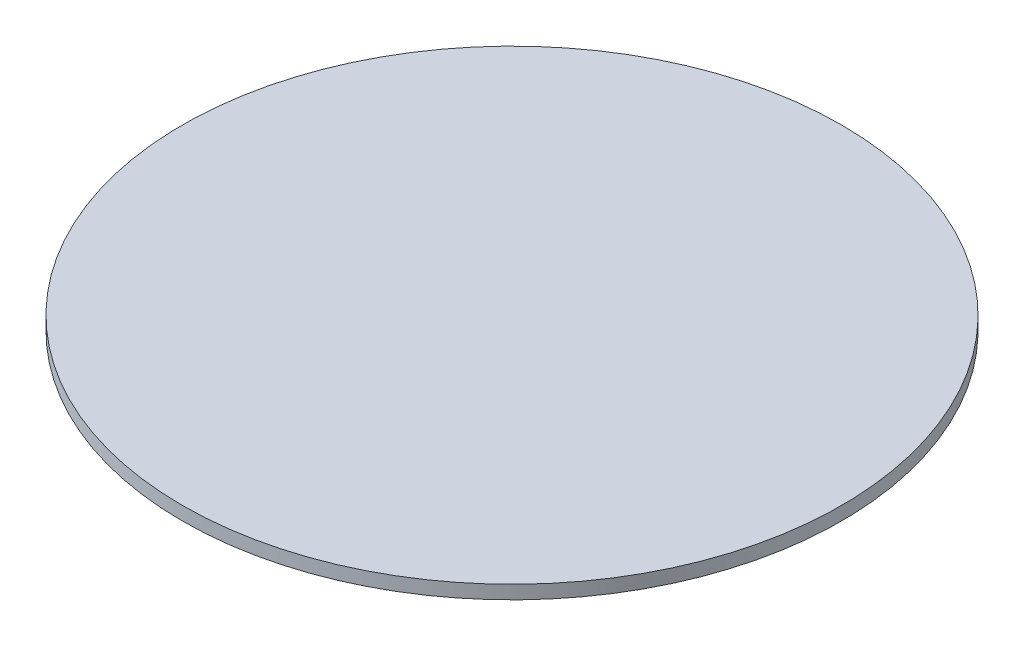
ISO-10303-21;
HEADER;
FILE_DESCRIPTION(('STEP AP214'),'2;1');
FILE_NAME('part.step','',(''),(''),'','','');
FILE_SCHEMA(('AUTOMOTIVE_DESIGN { 1 0 10303 214 1 1 1 1 }'));
ENDSEC;
DATA;
#1=APPLICATION_CONTEXT('core data for automotive mechanical design processes');
#2=APPLICATION_PROTOCOL_DEFINITION('international standard','automotive_design',2000,#1);
#3=PRODUCT_CONTEXT('',#1,'mechanical');
#4=PRODUCT('Part','Part','',(#3));
#5=PRODUCT_RELATED_PRODUCT_CATEGORY('part','',(#4));
#6=PRODUCT_DEFINITION_FORMATION('','',#4);
#7=PRODUCT_DEFINITION_CONTEXT('part definition',#1,'design');
#8=PRODUCT_DEFINITION('design','',#6,#7);
#9=PRODUCT_DEFINITION_SHAPE('','',#8);
#10=(LENGTH_UNIT() NAMED_UNIT(*) SI_UNIT(.MILLI.,.METRE.));
#11=(NAMED_UNIT(*) PLANE_ANGLE_UNIT() SI_UNIT($,.RADIAN.));
#12=(NAMED_UNIT(*) SI_UNIT($,.STERADIAN.) SOLID_ANGLE_UNIT());
#13=UNCERTAINTY_MEASURE_WITH_UNIT(LENGTH_MEASURE(1.E-05),#10,'distance_accuracy_value','');
#14=(GEOMETRIC_REPRESENTATION_CONTEXT(3) GLOBAL_UNCERTAINTY_ASSIGNED_CONTEXT((#13)) GLOBAL_UNIT_ASSIGNED_CONTEXT((#10,
#11,#12)) REPRESENTATION_CONTEXT('',''));
#15=CARTESIAN_POINT('',(0.,0.,0.));
#16=DIRECTION('',(0.,0.,1.));
#17=DIRECTION('',(1.,0.,0.));
#18=AXIS2_PLACEMENT_3D('',#15,#16,#17);
#19=CARTESIAN_POINT('',(0.,3.,0.));
#20=DIRECTION('',(0.,-1.,0.));
#21=DIRECTION('',(0.,0.,-1.));
#22=AXIS2_PLACEMENT_3D('',#19,#20,#21);
#23=CYLINDRICAL_SURFACE('',#22,73.2);
#24=CARTESIAN_POINT('',(0.,3.,0.));
#25=DIRECTION('',(0.,1.,0.));
#26=DIRECTION('',(0.,0.,1.));
#27=AXIS2_PLACEMENT_3D('',#24,#25,#26);
#28=CIRCLE('',#27,73.2);
#29=CARTESIAN_POINT('',(0.,3.,73.2));
#30=VERTEX_POINT('',#29);
#31=EDGE_CURVE('E10',#30,#30,#28,.T.);
#32=ORIENTED_EDGE('',*,*,#31,.F.);
#33=EDGE_LOOP('',(#32));
#34=FACE_BOUND('',#33,.T.);
#35=CARTESIAN_POINT('',(0.,0.,0.));
#36=DIRECTION('',(0.,1.,0.));
#37=DIRECTION('',(0.,0.,1.));
#38=AXIS2_PLACEMENT_3D('',#35,#36,#37);
#39=CIRCLE('',#38,73.2);
#40=CARTESIAN_POINT('',(0.,0.,73.2));
#41=VERTEX_POINT('',#40);
#42=EDGE_CURVE('E40',#41,#41,#39,.T.);
#43=ORIENTED_EDGE('',*,*,#42,.T.);
#44=EDGE_LOOP('',(#43));
#45=FACE_BOUND('',#44,.T.);
#46=ADVANCED_FACE('F37',(#34,#45),#23,.T.);
#47=CARTESIAN_POINT('',(0.,3.,0.));
#48=DIRECTION('',(0.,1.,0.));
#49=DIRECTION('',(0.,0.,1.));
#50=AXIS2_PLACEMENT_3D('',#47,#48,#49);
#51=PLANE('',#50);
#52=ORIENTED_EDGE('',*,*,#31,.T.);
#53=EDGE_LOOP('',(#52));
#54=FACE_BOUND('',#53,.T.);
#55=ADVANCED_FACE('F54',(#54),#51,.T.);
#56=CARTESIAN_POINT('',(0.,0.,0.));
#57=DIRECTION('',(0.,1.,0.));
#58=DIRECTION('',(0.,0.,1.));
#59=AXIS2_PLACEMENT_3D('',#56,#57,#58);
#60=PLANE('',#59);
#61=ORIENTED_EDGE('',*,*,#42,.F.);
#62=EDGE_LOOP('',(#61));
#63=FACE_BOUND('',#62,.T.);
#64=ADVANCED_FACE('F52',(#63),#60,.F.);
#65=CLOSED_SHELL('',(#46,#55,#64));
#66=MANIFOLD_SOLID_BREP('B2',#65);
#67=ADVANCED_BREP_SHAPE_REPRESENTATION('',(#18,#66),#14);
#68=SHAPE_DEFINITION_REPRESENTATION(#9,#67);
ENDSEC;
END-ISO-10303-21;
